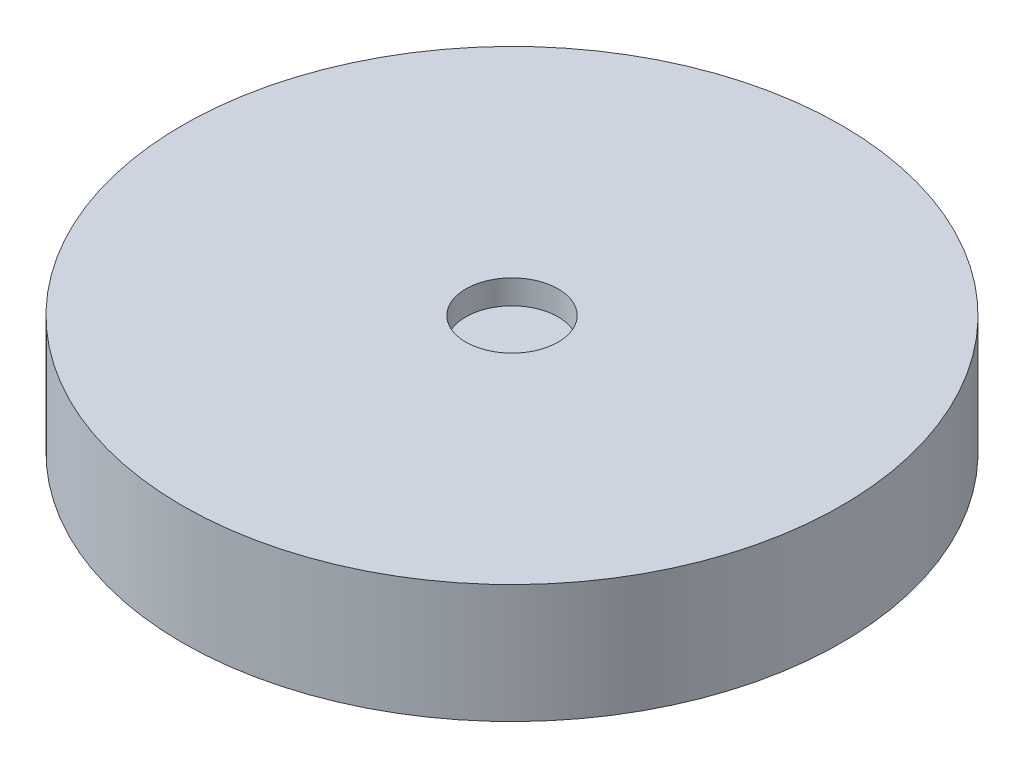
ISO-10303-21;
HEADER;
FILE_DESCRIPTION(('STEP AP214'),'2;1');
FILE_NAME('part.step','',(''),(''),'','','');
FILE_SCHEMA(('AUTOMOTIVE_DESIGN { 1 0 10303 214 1 1 1 1 }'));
ENDSEC;
DATA;
#1=APPLICATION_CONTEXT('core data for automotive mechanical design processes');
#2=APPLICATION_PROTOCOL_DEFINITION('international standard','automotive_design',2000,#1);
#3=PRODUCT_CONTEXT('',#1,'mechanical');
#4=PRODUCT('Part','Part','',(#3));
#5=PRODUCT_RELATED_PRODUCT_CATEGORY('part','',(#4));
#6=PRODUCT_DEFINITION_FORMATION('','',#4);
#7=PRODUCT_DEFINITION_CONTEXT('part definition',#1,'design');
#8=PRODUCT_DEFINITION('design','',#6,#7);
#9=PRODUCT_DEFINITION_SHAPE('','',#8);
#10=(LENGTH_UNIT() NAMED_UNIT(*) SI_UNIT(.MILLI.,.METRE.));
#11=(NAMED_UNIT(*) PLANE_ANGLE_UNIT() SI_UNIT($,.RADIAN.));
#12=(NAMED_UNIT(*) SI_UNIT($,.STERADIAN.) SOLID_ANGLE_UNIT());
#13=UNCERTAINTY_MEASURE_WITH_UNIT(LENGTH_MEASURE(1.E-05),#10,'distance_accuracy_value','');
#14=(GEOMETRIC_REPRESENTATION_CONTEXT(3) GLOBAL_UNCERTAINTY_ASSIGNED_CONTEXT((#13)) GLOBAL_UNIT_ASSIGNED_CONTEXT((#10,
#11,#12)) REPRESENTATION_CONTEXT('',''));
#15=CARTESIAN_POINT('',(0.,0.,0.));
#16=DIRECTION('',(0.,0.,1.));
#17=DIRECTION('',(1.,0.,0.));
#18=AXIS2_PLACEMENT_3D('',#15,#16,#17);
#19=CARTESIAN_POINT('',(0.,9.,0.));
#20=DIRECTION('',(0.,-1.,0.));
#21=DIRECTION('',(0.,0.,-1.));
#22=AXIS2_PLACEMENT_3D('',#19,#20,#21);
#23=CYLINDRICAL_SURFACE('',#22,25.);
#24=CARTESIAN_POINT('',(0.,9.,0.));
#25=DIRECTION('',(0.,1.,0.));
#26=DIRECTION('',(0.,0.,1.));
#27=AXIS2_PLACEMENT_3D('',#24,#25,#26);
#28=CIRCLE('',#27,25.);
#29=CARTESIAN_POINT('',(0.,9.,25.));
#30=VERTEX_POINT('',#29);
#31=EDGE_CURVE('E10',#30,#30,#28,.T.);
#32=ORIENTED_EDGE('',*,*,#31,.F.);
#33=EDGE_LOOP('',(#32));
#34=FACE_BOUND('',#33,.T.);
#35=CARTESIAN_POINT('',(0.,0.,0.));
#36=DIRECTION('',(0.,1.,0.));
#37=DIRECTION('',(0.,0.,1.));
#38=AXIS2_PLACEMENT_3D('',#35,#36,#37);
#39=CIRCLE('',#38,25.);
#40=CARTESIAN_POINT('',(0.,0.,25.));
#41=VERTEX_POINT('',#40);
#42=EDGE_CURVE('E33',#41,#41,#39,.T.);
#43=ORIENTED_EDGE('',*,*,#42,.T.);
#44=EDGE_LOOP('',(#43));
#45=FACE_BOUND('',#44,.T.);
#46=ADVANCED_FACE('F30',(#34,#45),#23,.T.);
#47=CARTESIAN_POINT('',(0.,9.,0.));
#48=DIRECTION('',(0.,1.,0.));
#49=DIRECTION('',(0.,0.,1.));
#50=AXIS2_PLACEMENT_3D('',#47,#48,#49);
#51=PLANE('',#50);
#52=CARTESIAN_POINT('',(0.,9.,0.));
#53=DIRECTION('',(0.,1.,0.));
#54=DIRECTION('',(0.,0.,1.));
#55=AXIS2_PLACEMENT_3D('',#52,#53,#54);
#56=CIRCLE('',#55,3.5);
#57=CARTESIAN_POINT('',(0.,9.,3.5));
#58=VERTEX_POINT('',#57);
#59=EDGE_CURVE('E42',#58,#58,#56,.T.);
#60=ORIENTED_EDGE('',*,*,#59,.F.);
#61=EDGE_LOOP('',(#60));
#62=FACE_BOUND('',#61,.T.);
#63=ORIENTED_EDGE('',*,*,#31,.T.);
#64=EDGE_LOOP('',(#63));
#65=FACE_BOUND('',#64,.T.);
#66=ADVANCED_FACE('F57',(#62,#65),#51,.T.);
#67=CARTESIAN_POINT('',(0.,0.,0.));
#68=DIRECTION('',(0.,1.,0.));
#69=DIRECTION('',(0.,0.,1.));
#70=AXIS2_PLACEMENT_3D('',#67,#68,#69);
#71=PLANE('',#70);
#72=ORIENTED_EDGE('',*,*,#42,.F.);
#73=EDGE_LOOP('',(#72));
#74=FACE_BOUND('',#73,.T.);
#75=ADVANCED_FACE('F53',(#74),#71,.F.);
#76=CARTESIAN_POINT('',(0.,7.1625,0.));
#77=DIRECTION('',(0.,1.,0.));
#78=DIRECTION('',(0.,0.,1.));
#79=AXIS2_PLACEMENT_3D('',#76,#77,#78);
#80=CYLINDRICAL_SURFACE('',#79,3.5);
#81=CARTESIAN_POINT('',(0.,7.1625,0.));
#82=DIRECTION('',(0.,1.,0.));
#83=DIRECTION('',(0.,0.,1.));
#84=AXIS2_PLACEMENT_3D('',#81,#82,#83);
#85=CIRCLE('',#84,3.5);
#86=CARTESIAN_POINT('',(0.,7.1625,3.5));
#87=VERTEX_POINT('',#86);
#88=EDGE_CURVE('E40',#87,#87,#85,.T.);
#89=ORIENTED_EDGE('',*,*,#88,.F.);
#90=EDGE_LOOP('',(#89));
#91=FACE_BOUND('',#90,.T.);
#92=ORIENTED_EDGE('',*,*,#59,.T.);
#93=EDGE_LOOP('',(#92));
#94=FACE_BOUND('',#93,.T.);
#95=ADVANCED_FACE('F50',(#91,#94),#80,.F.);
#96=CARTESIAN_POINT('',(0.,7.1625,0.));
#97=DIRECTION('',(0.,1.,0.));
#98=DIRECTION('',(0.,0.,1.));
#99=AXIS2_PLACEMENT_3D('',#96,#97,#98);
#100=PLANE('',#99);
#101=ORIENTED_EDGE('',*,*,#88,.T.);
#102=EDGE_LOOP('',(#101));
#103=FACE_BOUND('',#102,.T.);
#104=ADVANCED_FACE('F48',(#103),#100,.T.);
#105=CLOSED_SHELL('',(#46,#66,#75,#95,#104));
#106=MANIFOLD_SOLID_BREP('B2',#105);
#107=ADVANCED_BREP_SHAPE_REPRESENTATION('',(#18,#106),#14);
#108=SHAPE_DEFINITION_REPRESENTATION(#9,#107);
ENDSEC;
END-ISO-10303-21;
